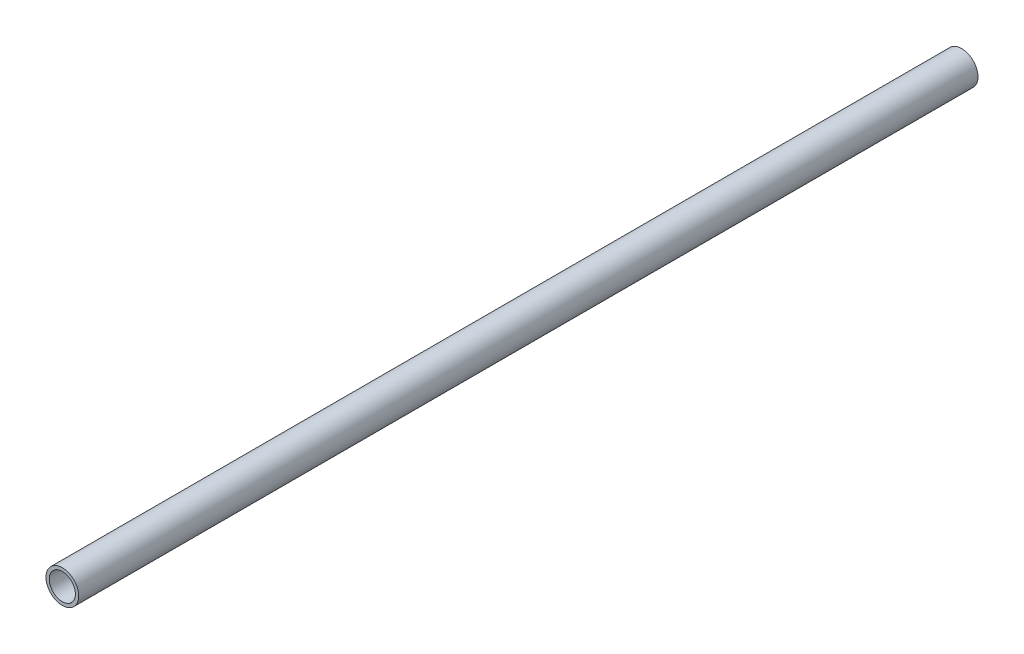
ISO-10303-21;
HEADER;
FILE_DESCRIPTION(('STEP AP214'),'2;1');
FILE_NAME('part.step','',(''),(''),'','','');
FILE_SCHEMA(('AUTOMOTIVE_DESIGN { 1 0 10303 214 1 1 1 1 }'));
ENDSEC;
DATA;
#1=APPLICATION_CONTEXT('core data for automotive mechanical design processes');
#2=APPLICATION_PROTOCOL_DEFINITION('international standard','automotive_design',2000,#1);
#3=PRODUCT_CONTEXT('',#1,'mechanical');
#4=PRODUCT('Part','Part','',(#3));
#5=PRODUCT_RELATED_PRODUCT_CATEGORY('part','',(#4));
#6=PRODUCT_DEFINITION_FORMATION('','',#4);
#7=PRODUCT_DEFINITION_CONTEXT('part definition',#1,'design');
#8=PRODUCT_DEFINITION('design','',#6,#7);
#9=PRODUCT_DEFINITION_SHAPE('','',#8);
#10=(LENGTH_UNIT() NAMED_UNIT(*) SI_UNIT(.MILLI.,.METRE.));
#11=(NAMED_UNIT(*) PLANE_ANGLE_UNIT() SI_UNIT($,.RADIAN.));
#12=(NAMED_UNIT(*) SI_UNIT($,.STERADIAN.) SOLID_ANGLE_UNIT());
#13=UNCERTAINTY_MEASURE_WITH_UNIT(LENGTH_MEASURE(1.E-05),#10,'distance_accuracy_value','');
#14=(GEOMETRIC_REPRESENTATION_CONTEXT(3) GLOBAL_UNCERTAINTY_ASSIGNED_CONTEXT((#13)) GLOBAL_UNIT_ASSIGNED_CONTEXT((#10,
#11,#12)) REPRESENTATION_CONTEXT('',''));
#15=CARTESIAN_POINT('',(0.,0.,0.));
#16=DIRECTION('',(0.,0.,1.));
#17=DIRECTION('',(1.,0.,0.));
#18=AXIS2_PLACEMENT_3D('',#15,#16,#17);
#19=CARTESIAN_POINT('',(0.,0.,275.));
#20=DIRECTION('',(0.,0.,1.));
#21=DIRECTION('',(1.,0.,0.));
#22=AXIS2_PLACEMENT_3D('',#19,#20,#21);
#23=PLANE('',#22);
#24=CARTESIAN_POINT('',(0.,0.,275.));
#25=DIRECTION('',(0.,0.,1.));
#26=DIRECTION('',(1.,0.,0.));
#27=AXIS2_PLACEMENT_3D('',#24,#25,#26);
#28=CIRCLE('',#27,5.);
#29=CARTESIAN_POINT('',(5.,0.,275.));
#30=VERTEX_POINT('',#29);
#31=EDGE_CURVE('E10',#30,#30,#28,.T.);
#32=ORIENTED_EDGE('',*,*,#31,.T.);
#33=EDGE_LOOP('',(#32));
#34=FACE_BOUND('',#33,.T.);
#35=CARTESIAN_POINT('',(0.,0.,275.));
#36=DIRECTION('',(0.,0.,1.));
#37=DIRECTION('',(1.,0.,0.));
#38=AXIS2_PLACEMENT_3D('',#35,#36,#37);
#39=CIRCLE('',#38,4.);
#40=CARTESIAN_POINT('',(4.,0.,275.));
#41=VERTEX_POINT('',#40);
#42=EDGE_CURVE('E48',#41,#41,#39,.T.);
#43=ORIENTED_EDGE('',*,*,#42,.F.);
#44=EDGE_LOOP('',(#43));
#45=FACE_BOUND('',#44,.T.);
#46=ADVANCED_FACE('F37',(#34,#45),#23,.T.);
#47=CARTESIAN_POINT('',(0.,0.,0.));
#48=DIRECTION('',(0.,0.,1.));
#49=DIRECTION('',(1.,0.,0.));
#50=AXIS2_PLACEMENT_3D('',#47,#48,#49);
#51=PLANE('',#50);
#52=CARTESIAN_POINT('',(0.,0.,0.));
#53=DIRECTION('',(0.,0.,1.));
#54=DIRECTION('',(1.,0.,0.));
#55=AXIS2_PLACEMENT_3D('',#52,#53,#54);
#56=CIRCLE('',#55,5.);
#57=CARTESIAN_POINT('',(5.,0.,0.));
#58=VERTEX_POINT('',#57);
#59=EDGE_CURVE('E41',#58,#58,#56,.T.);
#60=ORIENTED_EDGE('',*,*,#59,.F.);
#61=EDGE_LOOP('',(#60));
#62=FACE_BOUND('',#61,.T.);
#63=CARTESIAN_POINT('',(0.,0.,0.));
#64=DIRECTION('',(0.,0.,1.));
#65=DIRECTION('',(1.,0.,0.));
#66=AXIS2_PLACEMENT_3D('',#63,#64,#65);
#67=CIRCLE('',#66,4.);
#68=CARTESIAN_POINT('',(4.,0.,0.));
#69=VERTEX_POINT('',#68);
#70=EDGE_CURVE('E50',#69,#69,#67,.T.);
#71=ORIENTED_EDGE('',*,*,#70,.T.);
#72=EDGE_LOOP('',(#71));
#73=FACE_BOUND('',#72,.T.);
#74=ADVANCED_FACE('F60',(#62,#73),#51,.F.);
#75=CARTESIAN_POINT('',(0.,0.,275.));
#76=DIRECTION('',(0.,0.,-1.));
#77=DIRECTION('',(-1.,0.,0.));
#78=AXIS2_PLACEMENT_3D('',#75,#76,#77);
#79=CYLINDRICAL_SURFACE('',#78,5.);
#80=ORIENTED_EDGE('',*,*,#31,.F.);
#81=EDGE_LOOP('',(#80));
#82=FACE_BOUND('',#81,.T.);
#83=ORIENTED_EDGE('',*,*,#59,.T.);
#84=EDGE_LOOP('',(#83));
#85=FACE_BOUND('',#84,.T.);
#86=ADVANCED_FACE('F39',(#82,#85),#79,.T.);
#87=CARTESIAN_POINT('',(0.,0.,275.));
#88=DIRECTION('',(0.,0.,-1.));
#89=DIRECTION('',(-1.,0.,0.));
#90=AXIS2_PLACEMENT_3D('',#87,#88,#89);
#91=CYLINDRICAL_SURFACE('',#90,4.);
#92=ORIENTED_EDGE('',*,*,#42,.T.);
#93=EDGE_LOOP('',(#92));
#94=FACE_BOUND('',#93,.T.);
#95=ORIENTED_EDGE('',*,*,#70,.F.);
#96=EDGE_LOOP('',(#95));
#97=FACE_BOUND('',#96,.T.);
#98=ADVANCED_FACE('F56',(#94,#97),#91,.F.);
#99=CLOSED_SHELL('',(#46,#74,#86,#98));
#100=MANIFOLD_SOLID_BREP('B2',#99);
#101=ADVANCED_BREP_SHAPE_REPRESENTATION('',(#18,#100),#14);
#102=SHAPE_DEFINITION_REPRESENTATION(#9,#101);
ENDSEC;
END-ISO-10303-21;
